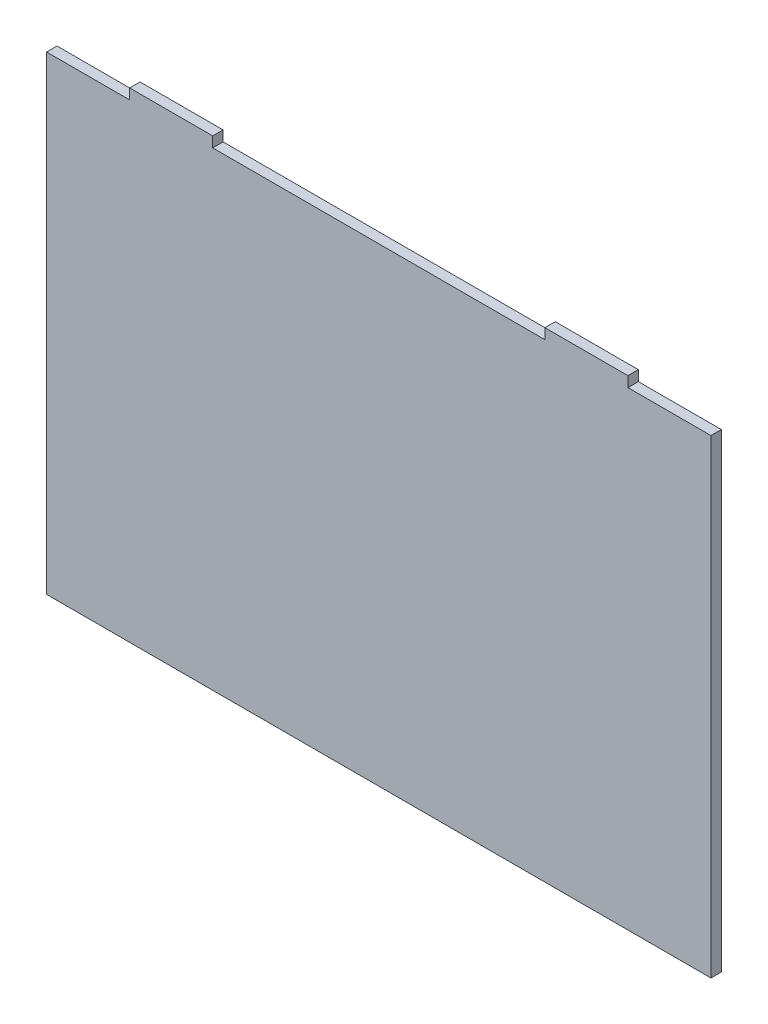
ISO-10303-21;
HEADER;
FILE_DESCRIPTION(('STEP AP214'),'2;1');
FILE_NAME('part.step','',(''),(''),'','','');
FILE_SCHEMA(('AUTOMOTIVE_DESIGN { 1 0 10303 214 1 1 1 1 }'));
ENDSEC;
DATA;
#1=APPLICATION_CONTEXT('core data for automotive mechanical design processes');
#2=APPLICATION_PROTOCOL_DEFINITION('international standard','automotive_design',2000,#1);
#3=PRODUCT_CONTEXT('',#1,'mechanical');
#4=PRODUCT('Part','Part','',(#3));
#5=PRODUCT_RELATED_PRODUCT_CATEGORY('part','',(#4));
#6=PRODUCT_DEFINITION_FORMATION('','',#4);
#7=PRODUCT_DEFINITION_CONTEXT('part definition',#1,'design');
#8=PRODUCT_DEFINITION('design','',#6,#7);
#9=PRODUCT_DEFINITION_SHAPE('','',#8);
#10=(LENGTH_UNIT() NAMED_UNIT(*) SI_UNIT(.MILLI.,.METRE.));
#11=(NAMED_UNIT(*) PLANE_ANGLE_UNIT() SI_UNIT($,.RADIAN.));
#12=(NAMED_UNIT(*) SI_UNIT($,.STERADIAN.) SOLID_ANGLE_UNIT());
#13=UNCERTAINTY_MEASURE_WITH_UNIT(LENGTH_MEASURE(1.E-05),#10,'distance_accuracy_value','');
#14=(GEOMETRIC_REPRESENTATION_CONTEXT(3) GLOBAL_UNCERTAINTY_ASSIGNED_CONTEXT((#13)) GLOBAL_UNIT_ASSIGNED_CONTEXT((#10,
#11,#12)) REPRESENTATION_CONTEXT('',''));
#15=CARTESIAN_POINT('',(0.,0.,0.));
#16=DIRECTION('',(0.,0.,1.));
#17=DIRECTION('',(1.,0.,0.));
#18=AXIS2_PLACEMENT_3D('',#15,#16,#17);
#19=CARTESIAN_POINT('',(0.,0.,3.175));
#20=DIRECTION('',(1.,0.,0.));
#21=DIRECTION('',(0.,0.,-1.));
#22=AXIS2_PLACEMENT_3D('',#19,#20,#21);
#23=PLANE('',#22);
#24=DIRECTION('',(0.,-1.,0.));
#25=VECTOR('',#24,1.);
#26=CARTESIAN_POINT('',(0.,0.,0.));
#27=LINE('',#26,#25);
#28=CARTESIAN_POINT('',(0.,143.6878,0.));
#29=VERTEX_POINT('',#28);
#30=CARTESIAN_POINT('',(0.,0.,0.));
#31=VERTEX_POINT('',#30);
#32=EDGE_CURVE('E153',#29,#31,#27,.T.);
#33=ORIENTED_EDGE('',*,*,#32,.T.);
#34=DIRECTION('',(0.,0.,-1.));
#35=VECTOR('',#34,1.);
#36=CARTESIAN_POINT('',(0.,0.,3.175));
#37=LINE('',#36,#35);
#38=CARTESIAN_POINT('',(0.,0.,3.175));
#39=VERTEX_POINT('',#38);
#40=EDGE_CURVE('E11',#39,#31,#37,.T.);
#41=ORIENTED_EDGE('',*,*,#40,.F.);
#42=DIRECTION('',(0.,-1.,0.));
#43=VECTOR('',#42,1.);
#44=CARTESIAN_POINT('',(0.,0.,3.175));
#45=LINE('',#44,#43);
#46=CARTESIAN_POINT('',(0.,143.6878,3.175));
#47=VERTEX_POINT('',#46);
#48=EDGE_CURVE('E175',#47,#39,#45,.T.);
#49=ORIENTED_EDGE('',*,*,#48,.F.);
#50=DIRECTION('',(0.,0.,-1.));
#51=VECTOR('',#50,1.);
#52=CARTESIAN_POINT('',(0.,143.6878,3.175));
#53=LINE('',#52,#51);
#54=EDGE_CURVE('E149',#47,#29,#53,.T.);
#55=ORIENTED_EDGE('',*,*,#54,.T.);
#56=EDGE_LOOP('',(#33,#41,#49,#55));
#57=FACE_BOUND('',#56,.T.);
#58=ADVANCED_FACE('F33',(#57),#23,.F.);
#59=CARTESIAN_POINT('',(0.,0.,3.175));
#60=DIRECTION('',(0.,1.,0.));
#61=DIRECTION('',(0.,0.,1.));
#62=AXIS2_PLACEMENT_3D('',#59,#60,#61);
#63=PLANE('',#62);
#64=DIRECTION('',(1.,0.,0.));
#65=VECTOR('',#64,1.);
#66=CARTESIAN_POINT('',(0.,0.,0.));
#67=LINE('',#66,#65);
#68=CARTESIAN_POINT('',(203.2,0.,0.));
#69=VERTEX_POINT('',#68);
#70=EDGE_CURVE('E156',#31,#69,#67,.T.);
#71=ORIENTED_EDGE('',*,*,#70,.T.);
#72=DIRECTION('',(0.,0.,-1.));
#73=VECTOR('',#72,1.);
#74=CARTESIAN_POINT('',(203.2,0.,3.175));
#75=LINE('',#74,#73);
#76=CARTESIAN_POINT('',(203.2,0.,3.175));
#77=VERTEX_POINT('',#76);
#78=EDGE_CURVE('E41',#77,#69,#75,.T.);
#79=ORIENTED_EDGE('',*,*,#78,.F.);
#80=DIRECTION('',(1.,0.,0.));
#81=VECTOR('',#80,1.);
#82=CARTESIAN_POINT('',(0.,0.,3.175));
#83=LINE('',#82,#81);
#84=EDGE_CURVE('E104',#39,#77,#83,.T.);
#85=ORIENTED_EDGE('',*,*,#84,.F.);
#86=ORIENTED_EDGE('',*,*,#40,.T.);
#87=EDGE_LOOP('',(#71,#79,#85,#86));
#88=FACE_BOUND('',#87,.T.);
#89=ADVANCED_FACE('F253',(#88),#63,.F.);
#90=CARTESIAN_POINT('',(203.2,0.,3.175));
#91=DIRECTION('',(-1.,0.,0.));
#92=DIRECTION('',(0.,0.,1.));
#93=AXIS2_PLACEMENT_3D('',#90,#91,#92);
#94=PLANE('',#93);
#95=DIRECTION('',(0.,1.,0.));
#96=VECTOR('',#95,1.);
#97=CARTESIAN_POINT('',(203.2,0.,0.));
#98=LINE('',#97,#96);
#99=CARTESIAN_POINT('',(203.2,143.6878,0.));
#100=VERTEX_POINT('',#99);
#101=EDGE_CURVE('E158',#69,#100,#98,.T.);
#102=ORIENTED_EDGE('',*,*,#101,.T.);
#103=DIRECTION('',(0.,0.,-1.));
#104=VECTOR('',#103,1.);
#105=CARTESIAN_POINT('',(203.2,143.6878,3.175));
#106=LINE('',#105,#104);
#107=CARTESIAN_POINT('',(203.2,143.6878,3.175));
#108=VERTEX_POINT('',#107);
#109=EDGE_CURVE('E194',#108,#100,#106,.T.);
#110=ORIENTED_EDGE('',*,*,#109,.F.);
#111=DIRECTION('',(0.,1.,0.));
#112=VECTOR('',#111,1.);
#113=CARTESIAN_POINT('',(203.2,0.,3.175));
#114=LINE('',#113,#112);
#115=EDGE_CURVE('E202',#77,#108,#114,.T.);
#116=ORIENTED_EDGE('',*,*,#115,.F.);
#117=ORIENTED_EDGE('',*,*,#78,.T.);
#118=EDGE_LOOP('',(#102,#110,#116,#117));
#119=FACE_BOUND('',#118,.T.);
#120=ADVANCED_FACE('F200',(#119),#94,.F.);
#121=CARTESIAN_POINT('',(177.8,143.6878,3.175));
#122=DIRECTION('',(0.,-1.,0.));
#123=DIRECTION('',(0.,0.,-1.));
#124=AXIS2_PLACEMENT_3D('',#121,#122,#123);
#125=PLANE('',#124);
#126=DIRECTION('',(-1.,0.,0.));
#127=VECTOR('',#126,1.);
#128=CARTESIAN_POINT('',(177.8,143.6878,0.));
#129=LINE('',#128,#127);
#130=CARTESIAN_POINT('',(177.8,143.6878,0.));
#131=VERTEX_POINT('',#130);
#132=EDGE_CURVE('E160',#100,#131,#129,.T.);
#133=ORIENTED_EDGE('',*,*,#132,.T.);
#134=DIRECTION('',(0.,0.,-1.));
#135=VECTOR('',#134,1.);
#136=CARTESIAN_POINT('',(177.8,143.6878,3.175));
#137=LINE('',#136,#135);
#138=CARTESIAN_POINT('',(177.8,143.6878,3.175));
#139=VERTEX_POINT('',#138);
#140=EDGE_CURVE('E191',#139,#131,#137,.T.);
#141=ORIENTED_EDGE('',*,*,#140,.F.);
#142=DIRECTION('',(-1.,0.,0.));
#143=VECTOR('',#142,1.);
#144=CARTESIAN_POINT('',(177.8,143.6878,3.175));
#145=LINE('',#144,#143);
#146=EDGE_CURVE('E220',#108,#139,#145,.T.);
#147=ORIENTED_EDGE('',*,*,#146,.F.);
#148=ORIENTED_EDGE('',*,*,#109,.T.);
#149=EDGE_LOOP('',(#133,#141,#147,#148));
#150=FACE_BOUND('',#149,.T.);
#151=ADVANCED_FACE('F211',(#150),#125,.F.);
#152=CARTESIAN_POINT('',(177.8,146.8628,3.175));
#153=DIRECTION('',(-1.,0.,0.));
#154=DIRECTION('',(0.,0.,1.));
#155=AXIS2_PLACEMENT_3D('',#152,#153,#154);
#156=PLANE('',#155);
#157=DIRECTION('',(0.,1.,0.));
#158=VECTOR('',#157,1.);
#159=CARTESIAN_POINT('',(177.8,146.8628,0.));
#160=LINE('',#159,#158);
#161=CARTESIAN_POINT('',(177.8,146.8628,0.));
#162=VERTEX_POINT('',#161);
#163=EDGE_CURVE('E162',#131,#162,#160,.T.);
#164=ORIENTED_EDGE('',*,*,#163,.T.);
#165=DIRECTION('',(0.,0.,-1.));
#166=VECTOR('',#165,1.);
#167=CARTESIAN_POINT('',(177.8,146.8628,3.175));
#168=LINE('',#167,#166);
#169=CARTESIAN_POINT('',(177.8,146.8628,3.175));
#170=VERTEX_POINT('',#169);
#171=EDGE_CURVE('E188',#170,#162,#168,.T.);
#172=ORIENTED_EDGE('',*,*,#171,.F.);
#173=DIRECTION('',(0.,1.,0.));
#174=VECTOR('',#173,1.);
#175=CARTESIAN_POINT('',(177.8,146.8628,3.175));
#176=LINE('',#175,#174);
#177=EDGE_CURVE('E217',#139,#170,#176,.T.);
#178=ORIENTED_EDGE('',*,*,#177,.F.);
#179=ORIENTED_EDGE('',*,*,#140,.T.);
#180=EDGE_LOOP('',(#164,#172,#178,#179));
#181=FACE_BOUND('',#180,.T.);
#182=ADVANCED_FACE('F215',(#181),#156,.F.);
#183=CARTESIAN_POINT('',(152.4,146.8628,3.175));
#184=DIRECTION('',(0.,-1.,0.));
#185=DIRECTION('',(0.,0.,-1.));
#186=AXIS2_PLACEMENT_3D('',#183,#184,#185);
#187=PLANE('',#186);
#188=DIRECTION('',(-1.,0.,0.));
#189=VECTOR('',#188,1.);
#190=CARTESIAN_POINT('',(152.4,146.8628,0.));
#191=LINE('',#190,#189);
#192=CARTESIAN_POINT('',(152.4,146.8628,0.));
#193=VERTEX_POINT('',#192);
#194=EDGE_CURVE('E164',#162,#193,#191,.T.);
#195=ORIENTED_EDGE('',*,*,#194,.T.);
#196=DIRECTION('',(0.,0.,-1.));
#197=VECTOR('',#196,1.);
#198=CARTESIAN_POINT('',(152.4,146.8628,3.175));
#199=LINE('',#198,#197);
#200=CARTESIAN_POINT('',(152.4,146.8628,3.175));
#201=VERTEX_POINT('',#200);
#202=EDGE_CURVE('E185',#201,#193,#199,.T.);
#203=ORIENTED_EDGE('',*,*,#202,.F.);
#204=DIRECTION('',(-1.,0.,0.));
#205=VECTOR('',#204,1.);
#206=CARTESIAN_POINT('',(152.4,146.8628,3.175));
#207=LINE('',#206,#205);
#208=EDGE_CURVE('E219',#170,#201,#207,.T.);
#209=ORIENTED_EDGE('',*,*,#208,.F.);
#210=ORIENTED_EDGE('',*,*,#171,.T.);
#211=EDGE_LOOP('',(#195,#203,#209,#210));
#212=FACE_BOUND('',#211,.T.);
#213=ADVANCED_FACE('F266',(#212),#187,.F.);
#214=CARTESIAN_POINT('',(152.4,143.6878,3.175));
#215=DIRECTION('',(1.,0.,0.));
#216=DIRECTION('',(0.,0.,-1.));
#217=AXIS2_PLACEMENT_3D('',#214,#215,#216);
#218=PLANE('',#217);
#219=DIRECTION('',(0.,-1.,0.));
#220=VECTOR('',#219,1.);
#221=CARTESIAN_POINT('',(152.4,143.6878,0.));
#222=LINE('',#221,#220);
#223=CARTESIAN_POINT('',(152.4,143.6878,0.));
#224=VERTEX_POINT('',#223);
#225=EDGE_CURVE('E166',#193,#224,#222,.T.);
#226=ORIENTED_EDGE('',*,*,#225,.T.);
#227=DIRECTION('',(0.,0.,-1.));
#228=VECTOR('',#227,1.);
#229=CARTESIAN_POINT('',(152.4,143.6878,3.175));
#230=LINE('',#229,#228);
#231=CARTESIAN_POINT('',(152.4,143.6878,3.175));
#232=VERTEX_POINT('',#231);
#233=EDGE_CURVE('E182',#232,#224,#230,.T.);
#234=ORIENTED_EDGE('',*,*,#233,.F.);
#235=DIRECTION('',(0.,-1.,0.));
#236=VECTOR('',#235,1.);
#237=CARTESIAN_POINT('',(152.4,143.6878,3.175));
#238=LINE('',#237,#236);
#239=EDGE_CURVE('E222',#201,#232,#238,.T.);
#240=ORIENTED_EDGE('',*,*,#239,.F.);
#241=ORIENTED_EDGE('',*,*,#202,.T.);
#242=EDGE_LOOP('',(#226,#234,#240,#241));
#243=FACE_BOUND('',#242,.T.);
#244=ADVANCED_FACE('F269',(#243),#218,.F.);
#245=CARTESIAN_POINT('',(50.8,143.6878,3.175));
#246=DIRECTION('',(0.,-1.,0.));
#247=DIRECTION('',(0.,0.,-1.));
#248=AXIS2_PLACEMENT_3D('',#245,#246,#247);
#249=PLANE('',#248);
#250=DIRECTION('',(-1.,0.,0.));
#251=VECTOR('',#250,1.);
#252=CARTESIAN_POINT('',(50.8,143.6878,0.));
#253=LINE('',#252,#251);
#254=CARTESIAN_POINT('',(50.8,143.6878,0.));
#255=VERTEX_POINT('',#254);
#256=EDGE_CURVE('E168',#224,#255,#253,.T.);
#257=ORIENTED_EDGE('',*,*,#256,.T.);
#258=DIRECTION('',(0.,0.,-1.));
#259=VECTOR('',#258,1.);
#260=CARTESIAN_POINT('',(50.8,143.6878,3.175));
#261=LINE('',#260,#259);
#262=CARTESIAN_POINT('',(50.8,143.6878,3.175));
#263=VERTEX_POINT('',#262);
#264=EDGE_CURVE('E179',#263,#255,#261,.T.);
#265=ORIENTED_EDGE('',*,*,#264,.F.);
#266=DIRECTION('',(-1.,0.,0.));
#267=VECTOR('',#266,1.);
#268=CARTESIAN_POINT('',(50.8,143.6878,3.175));
#269=LINE('',#268,#267);
#270=EDGE_CURVE('E228',#232,#263,#269,.T.);
#271=ORIENTED_EDGE('',*,*,#270,.F.);
#272=ORIENTED_EDGE('',*,*,#233,.T.);
#273=EDGE_LOOP('',(#257,#265,#271,#272));
#274=FACE_BOUND('',#273,.T.);
#275=ADVANCED_FACE('F234',(#274),#249,.F.);
#276=CARTESIAN_POINT('',(50.8,146.8628,3.175));
#277=DIRECTION('',(-1.,0.,0.));
#278=DIRECTION('',(0.,0.,1.));
#279=AXIS2_PLACEMENT_3D('',#276,#277,#278);
#280=PLANE('',#279);
#281=DIRECTION('',(0.,1.,0.));
#282=VECTOR('',#281,1.);
#283=CARTESIAN_POINT('',(50.8,146.8628,0.));
#284=LINE('',#283,#282);
#285=CARTESIAN_POINT('',(50.8,146.8628,0.));
#286=VERTEX_POINT('',#285);
#287=EDGE_CURVE('E170',#255,#286,#284,.T.);
#288=ORIENTED_EDGE('',*,*,#287,.T.);
#289=DIRECTION('',(0.,0.,-1.));
#290=VECTOR('',#289,1.);
#291=CARTESIAN_POINT('',(50.8,146.8628,3.175));
#292=LINE('',#291,#290);
#293=CARTESIAN_POINT('',(50.8,146.8628,3.175));
#294=VERTEX_POINT('',#293);
#295=EDGE_CURVE('E144',#294,#286,#292,.T.);
#296=ORIENTED_EDGE('',*,*,#295,.F.);
#297=DIRECTION('',(0.,1.,0.));
#298=VECTOR('',#297,1.);
#299=CARTESIAN_POINT('',(50.8,146.8628,3.175));
#300=LINE('',#299,#298);
#301=EDGE_CURVE('E135',#263,#294,#300,.T.);
#302=ORIENTED_EDGE('',*,*,#301,.F.);
#303=ORIENTED_EDGE('',*,*,#264,.T.);
#304=EDGE_LOOP('',(#288,#296,#302,#303));
#305=FACE_BOUND('',#304,.T.);
#306=ADVANCED_FACE('F238',(#305),#280,.F.);
#307=CARTESIAN_POINT('',(25.4,146.8628,3.175));
#308=DIRECTION('',(0.,-1.,0.));
#309=DIRECTION('',(0.,0.,-1.));
#310=AXIS2_PLACEMENT_3D('',#307,#308,#309);
#311=PLANE('',#310);
#312=DIRECTION('',(-1.,0.,0.));
#313=VECTOR('',#312,1.);
#314=CARTESIAN_POINT('',(25.4,146.8628,0.));
#315=LINE('',#314,#313);
#316=CARTESIAN_POINT('',(25.4,146.8628,0.));
#317=VERTEX_POINT('',#316);
#318=EDGE_CURVE('E143',#286,#317,#315,.T.);
#319=ORIENTED_EDGE('',*,*,#318,.T.);
#320=DIRECTION('',(0.,0.,-1.));
#321=VECTOR('',#320,1.);
#322=CARTESIAN_POINT('',(25.4,146.8628,3.175));
#323=LINE('',#322,#321);
#324=CARTESIAN_POINT('',(25.4,146.8628,3.175));
#325=VERTEX_POINT('',#324);
#326=EDGE_CURVE('E140',#325,#317,#323,.T.);
#327=ORIENTED_EDGE('',*,*,#326,.F.);
#328=DIRECTION('',(-1.,0.,0.));
#329=VECTOR('',#328,1.);
#330=CARTESIAN_POINT('',(25.4,146.8628,3.175));
#331=LINE('',#330,#329);
#332=EDGE_CURVE('E129',#294,#325,#331,.T.);
#333=ORIENTED_EDGE('',*,*,#332,.F.);
#334=ORIENTED_EDGE('',*,*,#295,.T.);
#335=EDGE_LOOP('',(#319,#327,#333,#334));
#336=FACE_BOUND('',#335,.T.);
#337=ADVANCED_FACE('F141',(#336),#311,.F.);
#338=CARTESIAN_POINT('',(25.4,143.6878,3.175));
#339=DIRECTION('',(1.,0.,0.));
#340=DIRECTION('',(0.,0.,-1.));
#341=AXIS2_PLACEMENT_3D('',#338,#339,#340);
#342=PLANE('',#341);
#343=DIRECTION('',(0.,-1.,0.));
#344=VECTOR('',#343,1.);
#345=CARTESIAN_POINT('',(25.4,143.6878,0.));
#346=LINE('',#345,#344);
#347=CARTESIAN_POINT('',(25.4,143.6878,0.));
#348=VERTEX_POINT('',#347);
#349=EDGE_CURVE('E90',#317,#348,#346,.T.);
#350=ORIENTED_EDGE('',*,*,#349,.T.);
#351=DIRECTION('',(0.,0.,-1.));
#352=VECTOR('',#351,1.);
#353=CARTESIAN_POINT('',(25.4,143.6878,3.175));
#354=LINE('',#353,#352);
#355=CARTESIAN_POINT('',(25.4,143.6878,3.175));
#356=VERTEX_POINT('',#355);
#357=EDGE_CURVE('E145',#356,#348,#354,.T.);
#358=ORIENTED_EDGE('',*,*,#357,.F.);
#359=DIRECTION('',(0.,-1.,0.));
#360=VECTOR('',#359,1.);
#361=CARTESIAN_POINT('',(25.4,143.6878,3.175));
#362=LINE('',#361,#360);
#363=EDGE_CURVE('E133',#325,#356,#362,.T.);
#364=ORIENTED_EDGE('',*,*,#363,.F.);
#365=ORIENTED_EDGE('',*,*,#326,.T.);
#366=EDGE_LOOP('',(#350,#358,#364,#365));
#367=FACE_BOUND('',#366,.T.);
#368=ADVANCED_FACE('F147',(#367),#342,.F.);
#369=CARTESIAN_POINT('',(0.,143.6878,3.175));
#370=DIRECTION('',(0.,-1.,0.));
#371=DIRECTION('',(0.,0.,-1.));
#372=AXIS2_PLACEMENT_3D('',#369,#370,#371);
#373=PLANE('',#372);
#374=DIRECTION('',(-1.,0.,0.));
#375=VECTOR('',#374,1.);
#376=CARTESIAN_POINT('',(0.,143.6878,0.));
#377=LINE('',#376,#375);
#378=EDGE_CURVE('E96',#348,#29,#377,.T.);
#379=ORIENTED_EDGE('',*,*,#378,.T.);
#380=ORIENTED_EDGE('',*,*,#54,.F.);
#381=DIRECTION('',(-1.,0.,0.));
#382=VECTOR('',#381,1.);
#383=CARTESIAN_POINT('',(0.,143.6878,3.175));
#384=LINE('',#383,#382);
#385=EDGE_CURVE('E49',#356,#47,#384,.T.);
#386=ORIENTED_EDGE('',*,*,#385,.F.);
#387=ORIENTED_EDGE('',*,*,#357,.T.);
#388=EDGE_LOOP('',(#379,#380,#386,#387));
#389=FACE_BOUND('',#388,.T.);
#390=ADVANCED_FACE('F242',(#389),#373,.F.);
#391=CARTESIAN_POINT('',(0.,0.,3.175));
#392=DIRECTION('',(0.,0.,-1.));
#393=DIRECTION('',(-1.,0.,0.));
#394=AXIS2_PLACEMENT_3D('',#391,#392,#393);
#395=PLANE('',#394);
#396=ORIENTED_EDGE('',*,*,#48,.T.);
#397=ORIENTED_EDGE('',*,*,#84,.T.);
#398=ORIENTED_EDGE('',*,*,#115,.T.);
#399=ORIENTED_EDGE('',*,*,#146,.T.);
#400=ORIENTED_EDGE('',*,*,#177,.T.);
#401=ORIENTED_EDGE('',*,*,#208,.T.);
#402=ORIENTED_EDGE('',*,*,#239,.T.);
#403=ORIENTED_EDGE('',*,*,#270,.T.);
#404=ORIENTED_EDGE('',*,*,#301,.T.);
#405=ORIENTED_EDGE('',*,*,#332,.T.);
#406=ORIENTED_EDGE('',*,*,#363,.T.);
#407=ORIENTED_EDGE('',*,*,#385,.T.);
#408=EDGE_LOOP('',(#396,#397,#398,#399,#400,#401,#402,#403,#404,#405,#406,#407));
#409=FACE_BOUND('',#408,.T.);
#410=ADVANCED_FACE('F131',(#409),#395,.F.);
#411=CARTESIAN_POINT('',(0.,0.,0.));
#412=DIRECTION('',(0.,0.,-1.));
#413=DIRECTION('',(-1.,0.,0.));
#414=AXIS2_PLACEMENT_3D('',#411,#412,#413);
#415=PLANE('',#414);
#416=ORIENTED_EDGE('',*,*,#32,.F.);
#417=ORIENTED_EDGE('',*,*,#378,.F.);
#418=ORIENTED_EDGE('',*,*,#349,.F.);
#419=ORIENTED_EDGE('',*,*,#318,.F.);
#420=ORIENTED_EDGE('',*,*,#287,.F.);
#421=ORIENTED_EDGE('',*,*,#256,.F.);
#422=ORIENTED_EDGE('',*,*,#225,.F.);
#423=ORIENTED_EDGE('',*,*,#194,.F.);
#424=ORIENTED_EDGE('',*,*,#163,.F.);
#425=ORIENTED_EDGE('',*,*,#132,.F.);
#426=ORIENTED_EDGE('',*,*,#101,.F.);
#427=ORIENTED_EDGE('',*,*,#70,.F.);
#428=EDGE_LOOP('',(#416,#417,#418,#419,#420,#421,#422,#423,#424,#425,#426,#427));
#429=FACE_BOUND('',#428,.T.);
#430=ADVANCED_FACE('F206',(#429),#415,.T.);
#431=CLOSED_SHELL('',(#58,#89,#120,#151,#182,#213,#244,#275,#306,#337,#368,#390,#410,#430));
#432=MANIFOLD_SOLID_BREP('B2',#431);
#433=ADVANCED_BREP_SHAPE_REPRESENTATION('',(#18,#432),#14);
#434=SHAPE_DEFINITION_REPRESENTATION(#9,#433);
ENDSEC;
END-ISO-10303-21;
